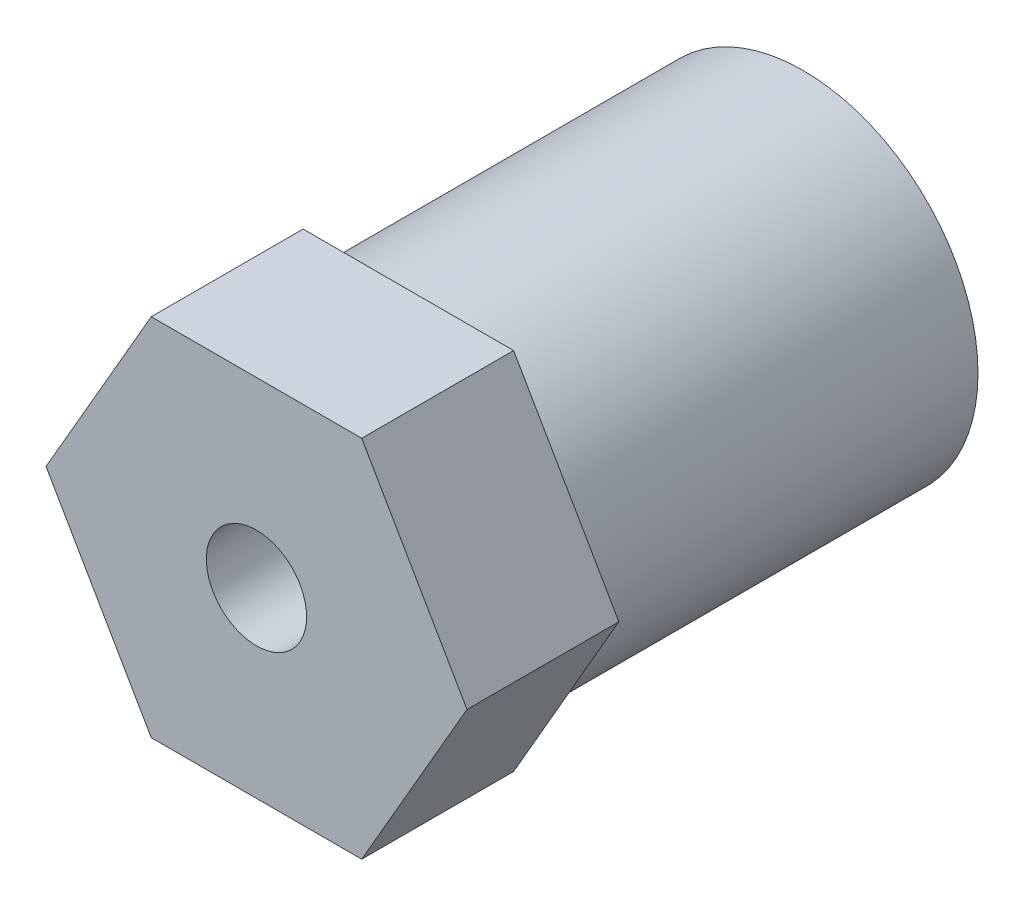
ISO-10303-21;
HEADER;
FILE_DESCRIPTION(('STEP AP214'),'2;1');
FILE_NAME('part.step','',(''),(''),'','','');
FILE_SCHEMA(('AUTOMOTIVE_DESIGN { 1 0 10303 214 1 1 1 1 }'));
ENDSEC;
DATA;
#1=APPLICATION_CONTEXT('core data for automotive mechanical design processes');
#2=APPLICATION_PROTOCOL_DEFINITION('international standard','automotive_design',2000,#1);
#3=PRODUCT_CONTEXT('',#1,'mechanical');
#4=PRODUCT('Part','Part','',(#3));
#5=PRODUCT_RELATED_PRODUCT_CATEGORY('part','',(#4));
#6=PRODUCT_DEFINITION_FORMATION('','',#4);
#7=PRODUCT_DEFINITION_CONTEXT('part definition',#1,'design');
#8=PRODUCT_DEFINITION('design','',#6,#7);
#9=PRODUCT_DEFINITION_SHAPE('','',#8);
#10=(LENGTH_UNIT() NAMED_UNIT(*) SI_UNIT(.MILLI.,.METRE.));
#11=(NAMED_UNIT(*) PLANE_ANGLE_UNIT() SI_UNIT($,.RADIAN.));
#12=(NAMED_UNIT(*) SI_UNIT($,.STERADIAN.) SOLID_ANGLE_UNIT());
#13=UNCERTAINTY_MEASURE_WITH_UNIT(LENGTH_MEASURE(1.E-05),#10,'distance_accuracy_value','');
#14=(GEOMETRIC_REPRESENTATION_CONTEXT(3) GLOBAL_UNCERTAINTY_ASSIGNED_CONTEXT((#13)) GLOBAL_UNIT_ASSIGNED_CONTEXT((#10,
#11,#12)) REPRESENTATION_CONTEXT('',''));
#15=CARTESIAN_POINT('',(0.,0.,0.));
#16=DIRECTION('',(0.,0.,1.));
#17=DIRECTION('',(1.,0.,0.));
#18=AXIS2_PLACEMENT_3D('',#15,#16,#17);
#19=CARTESIAN_POINT('',(0.,-5.75,13.));
#20=DIRECTION('',(0.,0.,-1.));
#21=DIRECTION('',(-1.,0.,0.));
#22=AXIS2_PLACEMENT_3D('',#19,#20,#21);
#23=PLANE('',#22);
#24=CARTESIAN_POINT('',(0.,0.,13.));
#25=DIRECTION('',(0.,0.,1.));
#26=DIRECTION('',(1.,0.,0.));
#27=AXIS2_PLACEMENT_3D('',#24,#25,#26);
#28=CIRCLE('',#27,5.75);
#29=CARTESIAN_POINT('',(5.75,0.,13.));
#30=VERTEX_POINT('',#29);
#31=EDGE_CURVE('E206',#30,#30,#28,.T.);
#32=ORIENTED_EDGE('',*,*,#31,.T.);
#33=EDGE_LOOP('',(#32));
#34=FACE_BOUND('',#33,.T.);
#35=DIRECTION('',(0.5,0.866025403784439,0.));
#36=VECTOR('',#35,1.);
#37=CARTESIAN_POINT('',(-7.68597545858689,-1.3125,13.));
#38=LINE('',#37,#36);
#39=CARTESIAN_POINT('',(-6.92820323027551,0.,13.));
#40=VERTEX_POINT('',#39);
#41=CARTESIAN_POINT('',(-3.46410161513775,6.,13.));
#42=VERTEX_POINT('',#41);
#43=EDGE_CURVE('E164',#40,#42,#38,.T.);
#44=ORIENTED_EDGE('',*,*,#43,.T.);
#45=DIRECTION('',(1.,0.,0.));
#46=VECTOR('',#45,1.);
#47=CARTESIAN_POINT('',(0.,6.,13.));
#48=LINE('',#47,#46);
#49=CARTESIAN_POINT('',(3.46410161513775,6.,13.));
#50=VERTEX_POINT('',#49);
#51=EDGE_CURVE('E190',#42,#50,#48,.T.);
#52=ORIENTED_EDGE('',*,*,#51,.T.);
#53=DIRECTION('',(0.500000000000001,-0.866025403784438,0.));
#54=VECTOR('',#53,1.);
#55=CARTESIAN_POINT('',(7.6859754585869,-1.31249999999999,13.));
#56=LINE('',#55,#54);
#57=CARTESIAN_POINT('',(6.92820323027551,0.,13.));
#58=VERTEX_POINT('',#57);
#59=EDGE_CURVE('E186',#50,#58,#56,.T.);
#60=ORIENTED_EDGE('',*,*,#59,.T.);
#61=DIRECTION('',(-0.5,-0.866025403784439,0.));
#62=VECTOR('',#61,1.);
#63=CARTESIAN_POINT('',(2.70632938682638,-7.3125,13.));
#64=LINE('',#63,#62);
#65=CARTESIAN_POINT('',(3.46410161513776,-6.,13.));
#66=VERTEX_POINT('',#65);
#67=EDGE_CURVE('E182',#58,#66,#64,.T.);
#68=ORIENTED_EDGE('',*,*,#67,.T.);
#69=DIRECTION('',(-1.,0.,0.));
#70=VECTOR('',#69,1.);
#71=CARTESIAN_POINT('',(0.,-6.,13.));
#72=LINE('',#71,#70);
#73=CARTESIAN_POINT('',(-3.46410161513775,-6.,13.));
#74=VERTEX_POINT('',#73);
#75=EDGE_CURVE('E179',#66,#74,#72,.T.);
#76=ORIENTED_EDGE('',*,*,#75,.T.);
#77=DIRECTION('',(-0.5,0.866025403784439,0.));
#78=VECTOR('',#77,1.);
#79=CARTESIAN_POINT('',(-2.70632938682637,-7.3125,13.));
#80=LINE('',#79,#78);
#81=EDGE_CURVE('E127',#74,#40,#80,.T.);
#82=ORIENTED_EDGE('',*,*,#81,.T.);
#83=EDGE_LOOP('',(#44,#52,#60,#68,#76,#82));
#84=FACE_BOUND('',#83,.T.);
#85=ADVANCED_FACE('F70',(#34,#84),#23,.T.);
#86=CARTESIAN_POINT('',(0.,-8.75000000000001,18.));
#87=DIRECTION('',(0.,0.,1.));
#88=DIRECTION('',(1.,0.,0.));
#89=AXIS2_PLACEMENT_3D('',#86,#87,#88);
#90=PLANE('',#89);
#91=CARTESIAN_POINT('',(0.,0.,18.));
#92=DIRECTION('',(0.,0.,1.));
#93=DIRECTION('',(1.,0.,0.));
#94=AXIS2_PLACEMENT_3D('',#91,#92,#93);
#95=CIRCLE('',#94,1.64999999999999);
#96=CARTESIAN_POINT('',(1.64999999999999,0.,18.));
#97=VERTEX_POINT('',#96);
#98=EDGE_CURVE('E194',#97,#97,#95,.T.);
#99=ORIENTED_EDGE('',*,*,#98,.F.);
#100=EDGE_LOOP('',(#99));
#101=FACE_BOUND('',#100,.T.);
#102=DIRECTION('',(-0.500000000000001,0.866025403784438,0.));
#103=VECTOR('',#102,1.);
#104=CARTESIAN_POINT('',(6.92820323027551,0.,18.));
#105=LINE('',#104,#103);
#106=CARTESIAN_POINT('',(6.92820323027551,0.,18.));
#107=VERTEX_POINT('',#106);
#108=CARTESIAN_POINT('',(3.46410161513775,6.,18.));
#109=VERTEX_POINT('',#108);
#110=EDGE_CURVE('E158',#107,#109,#105,.T.);
#111=ORIENTED_EDGE('',*,*,#110,.T.);
#112=DIRECTION('',(-1.,0.,0.));
#113=VECTOR('',#112,1.);
#114=CARTESIAN_POINT('',(3.46410161513775,6.,18.));
#115=LINE('',#114,#113);
#116=CARTESIAN_POINT('',(-3.46410161513776,6.,18.));
#117=VERTEX_POINT('',#116);
#118=EDGE_CURVE('E152',#109,#117,#115,.T.);
#119=ORIENTED_EDGE('',*,*,#118,.T.);
#120=DIRECTION('',(-0.5,-0.866025403784439,0.));
#121=VECTOR('',#120,1.);
#122=CARTESIAN_POINT('',(-3.46410161513775,6.,18.));
#123=LINE('',#122,#121);
#124=CARTESIAN_POINT('',(-6.92820323027551,0.,18.));
#125=VERTEX_POINT('',#124);
#126=EDGE_CURVE('E148',#117,#125,#123,.T.);
#127=ORIENTED_EDGE('',*,*,#126,.T.);
#128=DIRECTION('',(0.5,-0.866025403784438,0.));
#129=VECTOR('',#128,1.);
#130=CARTESIAN_POINT('',(-6.92820323027551,0.,18.));
#131=LINE('',#130,#129);
#132=CARTESIAN_POINT('',(-3.46410161513775,-6.,18.));
#133=VERTEX_POINT('',#132);
#134=EDGE_CURVE('E94',#125,#133,#131,.T.);
#135=ORIENTED_EDGE('',*,*,#134,.T.);
#136=DIRECTION('',(1.,0.,0.));
#137=VECTOR('',#136,1.);
#138=CARTESIAN_POINT('',(-3.46410161513775,-6.,18.));
#139=LINE('',#138,#137);
#140=CARTESIAN_POINT('',(3.46410161513776,-6.,18.));
#141=VERTEX_POINT('',#140);
#142=EDGE_CURVE('E135',#133,#141,#139,.T.);
#143=ORIENTED_EDGE('',*,*,#142,.T.);
#144=DIRECTION('',(0.5,0.866025403784439,0.));
#145=VECTOR('',#144,1.);
#146=CARTESIAN_POINT('',(3.46410161513776,-6.,18.));
#147=LINE('',#146,#145);
#148=EDGE_CURVE('E142',#141,#107,#147,.T.);
#149=ORIENTED_EDGE('',*,*,#148,.T.);
#150=EDGE_LOOP('',(#111,#119,#127,#135,#143,#149));
#151=FACE_BOUND('',#150,.T.);
#152=ADVANCED_FACE('F146',(#101,#151),#90,.T.);
#153=CARTESIAN_POINT('',(0.,0.,36.9652406755217));
#154=DIRECTION('',(0.,0.,1.));
#155=DIRECTION('',(1.,0.,0.));
#156=AXIS2_PLACEMENT_3D('',#153,#154,#155);
#157=CYLINDRICAL_SURFACE('',#156,2.);
#158=CARTESIAN_POINT('',(0.,0.,13.));
#159=DIRECTION('',(0.,0.,1.));
#160=DIRECTION('',(1.,0.,0.));
#161=AXIS2_PLACEMENT_3D('',#158,#159,#160);
#162=CIRCLE('',#161,2.);
#163=CARTESIAN_POINT('',(2.,0.,13.));
#164=VERTEX_POINT('',#163);
#165=EDGE_CURVE('E202',#164,#164,#162,.T.);
#166=ORIENTED_EDGE('',*,*,#165,.T.);
#167=EDGE_LOOP('',(#166));
#168=FACE_BOUND('',#167,.T.);
#169=CARTESIAN_POINT('',(0.,0.,0.));
#170=DIRECTION('',(0.,0.,1.));
#171=DIRECTION('',(1.,0.,0.));
#172=AXIS2_PLACEMENT_3D('',#169,#170,#171);
#173=CIRCLE('',#172,2.);
#174=CARTESIAN_POINT('',(2.,0.,0.));
#175=VERTEX_POINT('',#174);
#176=EDGE_CURVE('E13',#175,#175,#173,.T.);
#177=ORIENTED_EDGE('',*,*,#176,.F.);
#178=EDGE_LOOP('',(#177));
#179=FACE_BOUND('',#178,.T.);
#180=ADVANCED_FACE('F72',(#168,#179),#157,.F.);
#181=CARTESIAN_POINT('',(0.,-2.,0.));
#182=DIRECTION('',(0.,0.,-1.));
#183=DIRECTION('',(-1.,0.,0.));
#184=AXIS2_PLACEMENT_3D('',#181,#182,#183);
#185=PLANE('',#184);
#186=ORIENTED_EDGE('',*,*,#176,.T.);
#187=EDGE_LOOP('',(#186));
#188=FACE_BOUND('',#187,.T.);
#189=CARTESIAN_POINT('',(0.,0.,0.));
#190=DIRECTION('',(0.,0.,1.));
#191=DIRECTION('',(1.,0.,0.));
#192=AXIS2_PLACEMENT_3D('',#189,#190,#191);
#193=CIRCLE('',#192,5.75);
#194=CARTESIAN_POINT('',(5.75,0.,0.));
#195=VERTEX_POINT('',#194);
#196=EDGE_CURVE('E79',#195,#195,#193,.T.);
#197=ORIENTED_EDGE('',*,*,#196,.F.);
#198=EDGE_LOOP('',(#197));
#199=FACE_BOUND('',#198,.T.);
#200=ADVANCED_FACE('F216',(#188,#199),#185,.T.);
#201=CARTESIAN_POINT('',(0.,0.,36.9652406755217));
#202=DIRECTION('',(0.,0.,1.));
#203=DIRECTION('',(1.,0.,0.));
#204=AXIS2_PLACEMENT_3D('',#201,#202,#203);
#205=CYLINDRICAL_SURFACE('',#204,5.75);
#206=ORIENTED_EDGE('',*,*,#196,.T.);
#207=EDGE_LOOP('',(#206));
#208=FACE_BOUND('',#207,.T.);
#209=ORIENTED_EDGE('',*,*,#31,.F.);
#210=EDGE_LOOP('',(#209));
#211=FACE_BOUND('',#210,.T.);
#212=ADVANCED_FACE('F213',(#208,#211),#205,.T.);
#213=CARTESIAN_POINT('',(0.,-2.,13.));
#214=DIRECTION('',(0.,0.,-1.));
#215=DIRECTION('',(-1.,0.,0.));
#216=AXIS2_PLACEMENT_3D('',#213,#214,#215);
#217=PLANE('',#216);
#218=CARTESIAN_POINT('',(0.,0.,13.));
#219=DIRECTION('',(0.,0.,1.));
#220=DIRECTION('',(1.,0.,0.));
#221=AXIS2_PLACEMENT_3D('',#218,#219,#220);
#222=CIRCLE('',#221,1.64999999999999);
#223=CARTESIAN_POINT('',(1.64999999999999,0.,13.));
#224=VERTEX_POINT('',#223);
#225=EDGE_CURVE('E198',#224,#224,#222,.T.);
#226=ORIENTED_EDGE('',*,*,#225,.T.);
#227=EDGE_LOOP('',(#226));
#228=FACE_BOUND('',#227,.T.);
#229=ORIENTED_EDGE('',*,*,#165,.F.);
#230=EDGE_LOOP('',(#229));
#231=FACE_BOUND('',#230,.T.);
#232=ADVANCED_FACE('F223',(#228,#231),#217,.T.);
#233=CARTESIAN_POINT('',(0.,0.,18.));
#234=DIRECTION('',(0.,0.,1.));
#235=DIRECTION('',(1.,0.,0.));
#236=AXIS2_PLACEMENT_3D('',#233,#234,#235);
#237=CYLINDRICAL_SURFACE('',#236,1.64999999999999);
#238=ORIENTED_EDGE('',*,*,#225,.F.);
#239=EDGE_LOOP('',(#238));
#240=FACE_BOUND('',#239,.T.);
#241=ORIENTED_EDGE('',*,*,#98,.T.);
#242=EDGE_LOOP('',(#241));
#243=FACE_BOUND('',#242,.T.);
#244=ADVANCED_FACE('F238',(#240,#243),#237,.F.);
#245=CARTESIAN_POINT('',(3.46410161513775,6.,0.));
#246=DIRECTION('',(0.,1.,0.));
#247=DIRECTION('',(-1.,0.,0.));
#248=AXIS2_PLACEMENT_3D('',#245,#246,#247);
#249=PLANE('',#248);
#250=DIRECTION('',(0.,0.,1.));
#251=VECTOR('',#250,1.);
#252=CARTESIAN_POINT('',(-3.46410161513775,6.,0.));
#253=LINE('',#252,#251);
#254=EDGE_CURVE('E86',#42,#117,#253,.T.);
#255=ORIENTED_EDGE('',*,*,#254,.T.);
#256=ORIENTED_EDGE('',*,*,#118,.F.);
#257=DIRECTION('',(0.,0.,1.));
#258=VECTOR('',#257,1.);
#259=CARTESIAN_POINT('',(3.46410161513775,6.,0.));
#260=LINE('',#259,#258);
#261=EDGE_CURVE('E161',#50,#109,#260,.T.);
#262=ORIENTED_EDGE('',*,*,#261,.F.);
#263=ORIENTED_EDGE('',*,*,#51,.F.);
#264=EDGE_LOOP('',(#255,#256,#262,#263));
#265=FACE_BOUND('',#264,.T.);
#266=ADVANCED_FACE('F242',(#265),#249,.T.);
#267=CARTESIAN_POINT('',(6.92820323027551,0.,0.));
#268=DIRECTION('',(0.866025403784438,0.5,0.));
#269=DIRECTION('',(-0.500000000000001,0.866025403784438,0.));
#270=AXIS2_PLACEMENT_3D('',#267,#268,#269);
#271=PLANE('',#270);
#272=ORIENTED_EDGE('',*,*,#261,.T.);
#273=ORIENTED_EDGE('',*,*,#110,.F.);
#274=DIRECTION('',(0.,0.,1.));
#275=VECTOR('',#274,1.);
#276=CARTESIAN_POINT('',(6.92820323027551,0.,0.));
#277=LINE('',#276,#275);
#278=EDGE_CURVE('E165',#58,#107,#277,.T.);
#279=ORIENTED_EDGE('',*,*,#278,.F.);
#280=ORIENTED_EDGE('',*,*,#59,.F.);
#281=EDGE_LOOP('',(#272,#273,#279,#280));
#282=FACE_BOUND('',#281,.T.);
#283=ADVANCED_FACE('F246',(#282),#271,.T.);
#284=CARTESIAN_POINT('',(3.46410161513776,-6.,0.));
#285=DIRECTION('',(0.866025403784439,-0.5,0.));
#286=DIRECTION('',(0.5,0.866025403784439,0.));
#287=AXIS2_PLACEMENT_3D('',#284,#285,#286);
#288=PLANE('',#287);
#289=ORIENTED_EDGE('',*,*,#278,.T.);
#290=ORIENTED_EDGE('',*,*,#148,.F.);
#291=DIRECTION('',(0.,0.,1.));
#292=VECTOR('',#291,1.);
#293=CARTESIAN_POINT('',(3.46410161513776,-6.,0.));
#294=LINE('',#293,#292);
#295=EDGE_CURVE('E131',#66,#141,#294,.T.);
#296=ORIENTED_EDGE('',*,*,#295,.F.);
#297=ORIENTED_EDGE('',*,*,#67,.F.);
#298=EDGE_LOOP('',(#289,#290,#296,#297));
#299=FACE_BOUND('',#298,.T.);
#300=ADVANCED_FACE('F255',(#299),#288,.T.);
#301=CARTESIAN_POINT('',(-3.46410161513775,-6.,0.));
#302=DIRECTION('',(0.,-1.,0.));
#303=DIRECTION('',(1.,0.,0.));
#304=AXIS2_PLACEMENT_3D('',#301,#302,#303);
#305=PLANE('',#304);
#306=ORIENTED_EDGE('',*,*,#295,.T.);
#307=ORIENTED_EDGE('',*,*,#142,.F.);
#308=DIRECTION('',(0.,0.,1.));
#309=VECTOR('',#308,1.);
#310=CARTESIAN_POINT('',(-3.46410161513775,-6.,0.));
#311=LINE('',#310,#309);
#312=EDGE_CURVE('E123',#74,#133,#311,.T.);
#313=ORIENTED_EDGE('',*,*,#312,.F.);
#314=ORIENTED_EDGE('',*,*,#75,.F.);
#315=EDGE_LOOP('',(#306,#307,#313,#314));
#316=FACE_BOUND('',#315,.T.);
#317=ADVANCED_FACE('F136',(#316),#305,.T.);
#318=CARTESIAN_POINT('',(-6.92820323027551,0.,0.));
#319=DIRECTION('',(-0.866025403784438,-0.5,0.));
#320=DIRECTION('',(0.5,-0.866025403784439,0.));
#321=AXIS2_PLACEMENT_3D('',#318,#319,#320);
#322=PLANE('',#321);
#323=ORIENTED_EDGE('',*,*,#312,.T.);
#324=ORIENTED_EDGE('',*,*,#134,.F.);
#325=DIRECTION('',(0.,0.,1.));
#326=VECTOR('',#325,1.);
#327=CARTESIAN_POINT('',(-6.92820323027551,0.,0.));
#328=LINE('',#327,#326);
#329=EDGE_CURVE('E132',#40,#125,#328,.T.);
#330=ORIENTED_EDGE('',*,*,#329,.F.);
#331=ORIENTED_EDGE('',*,*,#81,.F.);
#332=EDGE_LOOP('',(#323,#324,#330,#331));
#333=FACE_BOUND('',#332,.T.);
#334=ADVANCED_FACE('F125',(#333),#322,.T.);
#335=CARTESIAN_POINT('',(-3.46410161513775,6.,0.));
#336=DIRECTION('',(-0.866025403784439,0.5,0.));
#337=DIRECTION('',(-0.5,-0.866025403784439,0.));
#338=AXIS2_PLACEMENT_3D('',#335,#336,#337);
#339=PLANE('',#338);
#340=ORIENTED_EDGE('',*,*,#329,.T.);
#341=ORIENTED_EDGE('',*,*,#126,.F.);
#342=ORIENTED_EDGE('',*,*,#254,.F.);
#343=ORIENTED_EDGE('',*,*,#43,.F.);
#344=EDGE_LOOP('',(#340,#341,#342,#343));
#345=FACE_BOUND('',#344,.T.);
#346=ADVANCED_FACE('F248',(#345),#339,.T.);
#347=CLOSED_SHELL('',(#85,#152,#180,#200,#212,#232,#244,#266,#283,#300,#317,#334,#346));
#348=MANIFOLD_SOLID_BREP('B2',#347);
#349=ADVANCED_BREP_SHAPE_REPRESENTATION('',(#18,#348),#14);
#350=SHAPE_DEFINITION_REPRESENTATION(#9,#349);
ENDSEC;
END-ISO-10303-21;
